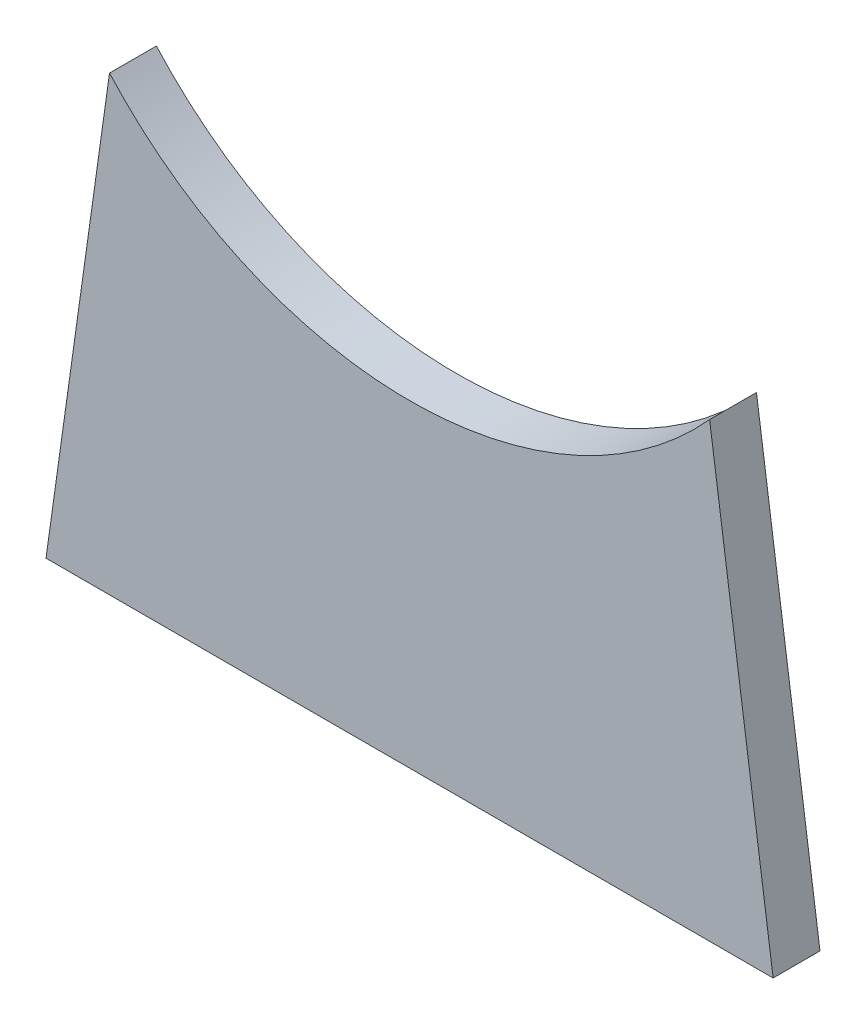
ISO-10303-21;
HEADER;
FILE_DESCRIPTION(('STEP AP214'),'2;1');
FILE_NAME('part.step','',(''),(''),'','','');
FILE_SCHEMA(('AUTOMOTIVE_DESIGN { 1 0 10303 214 1 1 1 1 }'));
ENDSEC;
DATA;
#1=APPLICATION_CONTEXT('core data for automotive mechanical design processes');
#2=APPLICATION_PROTOCOL_DEFINITION('international standard','automotive_design',2000,#1);
#3=PRODUCT_CONTEXT('',#1,'mechanical');
#4=PRODUCT('Part','Part','',(#3));
#5=PRODUCT_RELATED_PRODUCT_CATEGORY('part','',(#4));
#6=PRODUCT_DEFINITION_FORMATION('','',#4);
#7=PRODUCT_DEFINITION_CONTEXT('part definition',#1,'design');
#8=PRODUCT_DEFINITION('design','',#6,#7);
#9=PRODUCT_DEFINITION_SHAPE('','',#8);
#10=(LENGTH_UNIT() NAMED_UNIT(*) SI_UNIT(.MILLI.,.METRE.));
#11=(NAMED_UNIT(*) PLANE_ANGLE_UNIT() SI_UNIT($,.RADIAN.));
#12=(NAMED_UNIT(*) SI_UNIT($,.STERADIAN.) SOLID_ANGLE_UNIT());
#13=UNCERTAINTY_MEASURE_WITH_UNIT(LENGTH_MEASURE(1.E-05),#10,'distance_accuracy_value','');
#14=(GEOMETRIC_REPRESENTATION_CONTEXT(3) GLOBAL_UNCERTAINTY_ASSIGNED_CONTEXT((#13)) GLOBAL_UNIT_ASSIGNED_CONTEXT((#10,
#11,#12)) REPRESENTATION_CONTEXT('',''));
#15=CARTESIAN_POINT('',(0.,0.,0.));
#16=DIRECTION('',(0.,0.,1.));
#17=DIRECTION('',(1.,0.,0.));
#18=AXIS2_PLACEMENT_3D('',#15,#16,#17);
#19=CARTESIAN_POINT('',(-1978.1275,0.,127.5));
#20=DIRECTION('',(0.99026806874157,-0.139173100960069,0.));
#21=DIRECTION('',(0.139173100960069,0.99026806874157,0.));
#22=AXIS2_PLACEMENT_3D('',#19,#20,#21);
#23=PLANE('',#22);
#24=DIRECTION('',(-0.139173100960069,-0.99026806874157,0.));
#25=VECTOR('',#24,1.);
#26=CARTESIAN_POINT('',(-1978.1275,0.,-127.5));
#27=LINE('',#26,#25);
#28=CARTESIAN_POINT('',(-1632.57272267549,2458.75,-127.5));
#29=VERTEX_POINT('',#28);
#30=CARTESIAN_POINT('',(-1978.1275,0.,-127.5));
#31=VERTEX_POINT('',#30);
#32=EDGE_CURVE('E96',#29,#31,#27,.T.);
#33=ORIENTED_EDGE('',*,*,#32,.T.);
#34=DIRECTION('',(0.,0.,-1.));
#35=VECTOR('',#34,1.);
#36=CARTESIAN_POINT('',(-1978.1275,0.,127.5));
#37=LINE('',#36,#35);
#38=CARTESIAN_POINT('',(-1978.1275,0.,127.5));
#39=VERTEX_POINT('',#38);
#40=EDGE_CURVE('E11',#39,#31,#37,.T.);
#41=ORIENTED_EDGE('',*,*,#40,.F.);
#42=DIRECTION('',(-0.139173100960069,-0.99026806874157,0.));
#43=VECTOR('',#42,1.);
#44=CARTESIAN_POINT('',(-1978.1275,0.,127.5));
#45=LINE('',#44,#43);
#46=CARTESIAN_POINT('',(-1632.57272267549,2458.75,127.5));
#47=VERTEX_POINT('',#46);
#48=EDGE_CURVE('E84',#47,#39,#45,.T.);
#49=ORIENTED_EDGE('',*,*,#48,.F.);
#50=DIRECTION('',(0.,0.,-1.));
#51=VECTOR('',#50,1.);
#52=CARTESIAN_POINT('',(-1632.57272267549,2458.75,127.5));
#53=LINE('',#52,#51);
#54=EDGE_CURVE('E92',#47,#29,#53,.T.);
#55=ORIENTED_EDGE('',*,*,#54,.T.);
#56=EDGE_LOOP('',(#33,#41,#49,#55));
#57=FACE_BOUND('',#56,.T.);
#58=ADVANCED_FACE('F33',(#57),#23,.F.);
#59=CARTESIAN_POINT('',(-1978.1275,0.,127.5));
#60=DIRECTION('',(0.,1.,0.));
#61=DIRECTION('',(-1.,0.,0.));
#62=AXIS2_PLACEMENT_3D('',#59,#60,#61);
#63=PLANE('',#62);
#64=DIRECTION('',(1.,0.,0.));
#65=VECTOR('',#64,1.);
#66=CARTESIAN_POINT('',(-1978.1275,0.,-127.5));
#67=LINE('',#66,#65);
#68=CARTESIAN_POINT('',(1978.1275,4.84501502236071E-13,-127.5));
#69=VERTEX_POINT('',#68);
#70=EDGE_CURVE('E88',#31,#69,#67,.T.);
#71=ORIENTED_EDGE('',*,*,#70,.T.);
#72=DIRECTION('',(0.,0.,-1.));
#73=VECTOR('',#72,1.);
#74=CARTESIAN_POINT('',(1978.1275,4.84501502236071E-13,127.5));
#75=LINE('',#74,#73);
#76=CARTESIAN_POINT('',(1978.1275,4.84501502236071E-13,127.5));
#77=VERTEX_POINT('',#76);
#78=EDGE_CURVE('E41',#77,#69,#75,.T.);
#79=ORIENTED_EDGE('',*,*,#78,.F.);
#80=DIRECTION('',(1.,0.,0.));
#81=VECTOR('',#80,1.);
#82=CARTESIAN_POINT('',(-1978.1275,0.,127.5));
#83=LINE('',#82,#81);
#84=EDGE_CURVE('E79',#39,#77,#83,.T.);
#85=ORIENTED_EDGE('',*,*,#84,.F.);
#86=ORIENTED_EDGE('',*,*,#40,.T.);
#87=EDGE_LOOP('',(#71,#79,#85,#86));
#88=FACE_BOUND('',#87,.T.);
#89=ADVANCED_FACE('F87',(#88),#63,.F.);
#90=CARTESIAN_POINT('',(1978.1275,4.84501502236071E-13,127.5));
#91=DIRECTION('',(-0.99026806874157,-0.139173100960069,0.));
#92=DIRECTION('',(0.139173100960069,-0.99026806874157,0.));
#93=AXIS2_PLACEMENT_3D('',#90,#91,#92);
#94=PLANE('',#93);
#95=DIRECTION('',(-0.139173100960069,0.99026806874157,0.));
#96=VECTOR('',#95,1.);
#97=CARTESIAN_POINT('',(1978.1275,4.84501502236071E-13,-127.5));
#98=LINE('',#97,#96);
#99=CARTESIAN_POINT('',(1632.57272267549,2458.75,-127.5));
#100=VERTEX_POINT('',#99);
#101=EDGE_CURVE('E66',#69,#100,#98,.T.);
#102=ORIENTED_EDGE('',*,*,#101,.T.);
#103=DIRECTION('',(0.,0.,-1.));
#104=VECTOR('',#103,1.);
#105=CARTESIAN_POINT('',(1632.57272267549,2458.75,127.5));
#106=LINE('',#105,#104);
#107=CARTESIAN_POINT('',(1632.57272267549,2458.75,127.5));
#108=VERTEX_POINT('',#107);
#109=EDGE_CURVE('E89',#108,#100,#106,.T.);
#110=ORIENTED_EDGE('',*,*,#109,.F.);
#111=DIRECTION('',(-0.139173100960069,0.99026806874157,0.));
#112=VECTOR('',#111,1.);
#113=CARTESIAN_POINT('',(1978.1275,4.84501502236071E-13,127.5));
#114=LINE('',#113,#112);
#115=EDGE_CURVE('E82',#77,#108,#114,.T.);
#116=ORIENTED_EDGE('',*,*,#115,.F.);
#117=ORIENTED_EDGE('',*,*,#78,.T.);
#118=EDGE_LOOP('',(#102,#110,#116,#117));
#119=FACE_BOUND('',#118,.T.);
#120=ADVANCED_FACE('F90',(#119),#94,.F.);
#121=CARTESIAN_POINT('',(4.44089209850063E-13,3927.49441124927,127.5));
#122=DIRECTION('',(0.,0.,-1.));
#123=DIRECTION('',(-1.,0.,0.));
#124=AXIS2_PLACEMENT_3D('',#121,#122,#123);
#125=CYLINDRICAL_SURFACE('',#124,2196.02);
#126=CARTESIAN_POINT('',(4.44089209850063E-13,3927.49441124927,-127.5));
#127=DIRECTION('',(0.,0.,-1.));
#128=DIRECTION('',(1.,0.,0.));
#129=AXIS2_PLACEMENT_3D('',#126,#127,#128);
#130=CIRCLE('',#129,2196.02);
#131=EDGE_CURVE('E72',#100,#29,#130,.T.);
#132=ORIENTED_EDGE('',*,*,#131,.T.);
#133=ORIENTED_EDGE('',*,*,#54,.F.);
#134=CARTESIAN_POINT('',(4.44089209850063E-13,3927.49441124927,127.5));
#135=DIRECTION('',(0.,0.,-1.));
#136=DIRECTION('',(1.,0.,0.));
#137=AXIS2_PLACEMENT_3D('',#134,#135,#136);
#138=CIRCLE('',#137,2196.02);
#139=EDGE_CURVE('E49',#108,#47,#138,.T.);
#140=ORIENTED_EDGE('',*,*,#139,.F.);
#141=ORIENTED_EDGE('',*,*,#109,.T.);
#142=EDGE_LOOP('',(#132,#133,#140,#141));
#143=FACE_BOUND('',#142,.T.);
#144=ADVANCED_FACE('F103',(#143),#125,.F.);
#145=CARTESIAN_POINT('',(4.44089209850063E-13,3927.49441124927,127.5));
#146=DIRECTION('',(0.,0.,1.));
#147=DIRECTION('',(1.,0.,0.));
#148=AXIS2_PLACEMENT_3D('',#145,#146,#147);
#149=PLANE('',#148);
#150=ORIENTED_EDGE('',*,*,#48,.T.);
#151=ORIENTED_EDGE('',*,*,#84,.T.);
#152=ORIENTED_EDGE('',*,*,#115,.T.);
#153=ORIENTED_EDGE('',*,*,#139,.T.);
#154=EDGE_LOOP('',(#150,#151,#152,#153));
#155=FACE_BOUND('',#154,.T.);
#156=ADVANCED_FACE('F80',(#155),#149,.T.);
#157=CARTESIAN_POINT('',(4.44089209850063E-13,3927.49441124927,-127.5));
#158=DIRECTION('',(0.,0.,1.));
#159=DIRECTION('',(1.,0.,0.));
#160=AXIS2_PLACEMENT_3D('',#157,#158,#159);
#161=PLANE('',#160);
#162=ORIENTED_EDGE('',*,*,#32,.F.);
#163=ORIENTED_EDGE('',*,*,#131,.F.);
#164=ORIENTED_EDGE('',*,*,#101,.F.);
#165=ORIENTED_EDGE('',*,*,#70,.F.);
#166=EDGE_LOOP('',(#162,#163,#164,#165));
#167=FACE_BOUND('',#166,.T.);
#168=ADVANCED_FACE('F106',(#167),#161,.F.);
#169=CLOSED_SHELL('',(#58,#89,#120,#144,#156,#168));
#170=MANIFOLD_SOLID_BREP('B2',#169);
#171=ADVANCED_BREP_SHAPE_REPRESENTATION('',(#18,#170),#14);
#172=SHAPE_DEFINITION_REPRESENTATION(#9,#171);
ENDSEC;
END-ISO-10303-21;
